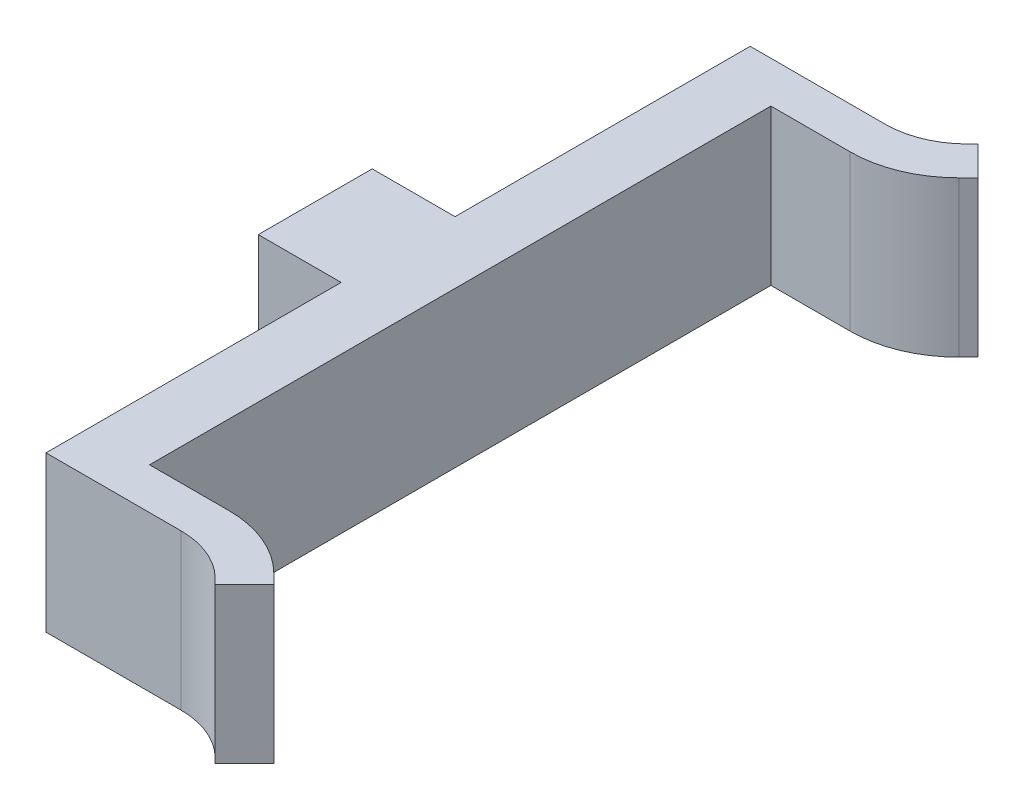
ISO-10303-21;
HEADER;
FILE_DESCRIPTION(('STEP AP214'),'2;1');
FILE_NAME('part.step','',(''),(''),'','','');
FILE_SCHEMA(('AUTOMOTIVE_DESIGN { 1 0 10303 214 1 1 1 1 }'));
ENDSEC;
DATA;
#1=APPLICATION_CONTEXT('core data for automotive mechanical design processes');
#2=APPLICATION_PROTOCOL_DEFINITION('international standard','automotive_design',2000,#1);
#3=PRODUCT_CONTEXT('',#1,'mechanical');
#4=PRODUCT('Part','Part','',(#3));
#5=PRODUCT_RELATED_PRODUCT_CATEGORY('part','',(#4));
#6=PRODUCT_DEFINITION_FORMATION('','',#4);
#7=PRODUCT_DEFINITION_CONTEXT('part definition',#1,'design');
#8=PRODUCT_DEFINITION('design','',#6,#7);
#9=PRODUCT_DEFINITION_SHAPE('','',#8);
#10=(LENGTH_UNIT() NAMED_UNIT(*) SI_UNIT(.MILLI.,.METRE.));
#11=(NAMED_UNIT(*) PLANE_ANGLE_UNIT() SI_UNIT($,.RADIAN.));
#12=(NAMED_UNIT(*) SI_UNIT($,.STERADIAN.) SOLID_ANGLE_UNIT());
#13=UNCERTAINTY_MEASURE_WITH_UNIT(LENGTH_MEASURE(1.E-05),#10,'distance_accuracy_value','');
#14=(GEOMETRIC_REPRESENTATION_CONTEXT(3) GLOBAL_UNCERTAINTY_ASSIGNED_CONTEXT((#13)) GLOBAL_UNIT_ASSIGNED_CONTEXT((#10,
#11,#12)) REPRESENTATION_CONTEXT('',''));
#15=CARTESIAN_POINT('',(0.,0.,0.));
#16=DIRECTION('',(0.,0.,1.));
#17=DIRECTION('',(1.,0.,0.));
#18=AXIS2_PLACEMENT_3D('',#15,#16,#17);
#19=CARTESIAN_POINT('',(0.,15.,0.));
#20=DIRECTION('',(-1.,0.,0.));
#21=DIRECTION('',(0.,0.,1.));
#22=AXIS2_PLACEMENT_3D('',#19,#20,#21);
#23=PLANE('',#22);
#24=DIRECTION('',(0.,0.,-1.));
#25=VECTOR('',#24,1.);
#26=CARTESIAN_POINT('',(0.,15.,0.));
#27=LINE('',#26,#25);
#28=CARTESIAN_POINT('',(0.,15.,34.));
#29=VERTEX_POINT('',#28);
#30=CARTESIAN_POINT('',(0.,15.,5.5));
#31=VERTEX_POINT('',#30);
#32=EDGE_CURVE('E281',#29,#31,#27,.T.);
#33=ORIENTED_EDGE('',*,*,#32,.T.);
#34=DIRECTION('',(0.,1.,0.));
#35=VECTOR('',#34,1.);
#36=CARTESIAN_POINT('',(0.,0.,5.5));
#37=LINE('',#36,#35);
#38=CARTESIAN_POINT('',(0.,0.,5.5));
#39=VERTEX_POINT('',#38);
#40=EDGE_CURVE('E64',#39,#31,#37,.T.);
#41=ORIENTED_EDGE('',*,*,#40,.F.);
#42=DIRECTION('',(0.,0.,-1.));
#43=VECTOR('',#42,1.);
#44=CARTESIAN_POINT('',(0.,0.,0.));
#45=LINE('',#44,#43);
#46=CARTESIAN_POINT('',(0.,0.,34.));
#47=VERTEX_POINT('',#46);
#48=EDGE_CURVE('E322',#47,#39,#45,.T.);
#49=ORIENTED_EDGE('',*,*,#48,.F.);
#50=DIRECTION('',(0.,-1.,0.));
#51=VECTOR('',#50,1.);
#52=CARTESIAN_POINT('',(0.,15.,34.));
#53=LINE('',#52,#51);
#54=EDGE_CURVE('E388',#29,#47,#53,.T.);
#55=ORIENTED_EDGE('',*,*,#54,.F.);
#56=EDGE_LOOP('',(#33,#41,#49,#55));
#57=FACE_BOUND('',#56,.T.);
#58=ADVANCED_FACE('F35',(#57),#23,.T.);
#59=DIRECTION('',(0.,1.,0.));
#60=VECTOR('',#59,1.);
#61=CARTESIAN_POINT('',(0.,0.,-5.5));
#62=LINE('',#61,#60);
#63=CARTESIAN_POINT('',(0.,0.,-5.5));
#64=VERTEX_POINT('',#63);
#65=CARTESIAN_POINT('',(0.,15.,-5.5));
#66=VERTEX_POINT('',#65);
#67=EDGE_CURVE('E56',#64,#66,#62,.T.);
#68=ORIENTED_EDGE('',*,*,#67,.T.);
#69=CARTESIAN_POINT('',(0.,15.,-34.));
#70=VERTEX_POINT('',#69);
#71=EDGE_CURVE('E234',#66,#70,#27,.T.);
#72=ORIENTED_EDGE('',*,*,#71,.T.);
#73=DIRECTION('',(0.,-1.,0.));
#74=VECTOR('',#73,1.);
#75=CARTESIAN_POINT('',(0.,15.,-34.));
#76=LINE('',#75,#74);
#77=CARTESIAN_POINT('',(0.,0.,-34.));
#78=VERTEX_POINT('',#77);
#79=EDGE_CURVE('E390',#70,#78,#76,.T.);
#80=ORIENTED_EDGE('',*,*,#79,.T.);
#81=EDGE_CURVE('E321',#64,#78,#45,.T.);
#82=ORIENTED_EDGE('',*,*,#81,.F.);
#83=EDGE_LOOP('',(#68,#72,#80,#82));
#84=FACE_BOUND('',#83,.T.);
#85=ADVANCED_FACE('F474',(#84),#23,.T.);
#86=CARTESIAN_POINT('',(13.0294372515229,15.,-42.));
#87=DIRECTION('',(0.,-1.,0.));
#88=DIRECTION('',(0.,0.,-1.));
#89=AXIS2_PLACEMENT_3D('',#86,#87,#88);
#90=CYLINDRICAL_SURFACE('',#89,8.);
#91=CARTESIAN_POINT('',(13.0294372515229,0.,-42.));
#92=DIRECTION('',(0.,1.,0.));
#93=DIRECTION('',(0.,0.,1.));
#94=AXIS2_PLACEMENT_3D('',#91,#92,#93);
#95=CIRCLE('',#94,8.);
#96=CARTESIAN_POINT('',(13.0294372515228,0.,-34.));
#97=VERTEX_POINT('',#96);
#98=CARTESIAN_POINT('',(18.6862915010153,0.,-36.3431457505077));
#99=VERTEX_POINT('',#98);
#100=EDGE_CURVE('E224',#97,#99,#95,.T.);
#101=ORIENTED_EDGE('',*,*,#100,.F.);
#102=DIRECTION('',(0.,-1.,0.));
#103=VECTOR('',#102,1.);
#104=CARTESIAN_POINT('',(13.0294372515228,15.,-34.));
#105=LINE('',#104,#103);
#106=CARTESIAN_POINT('',(13.0294372515228,15.,-34.));
#107=VERTEX_POINT('',#106);
#108=EDGE_CURVE('E393',#107,#97,#105,.T.);
#109=ORIENTED_EDGE('',*,*,#108,.F.);
#110=CARTESIAN_POINT('',(13.0294372515229,15.,-42.));
#111=DIRECTION('',(0.,1.,0.));
#112=DIRECTION('',(0.,0.,1.));
#113=AXIS2_PLACEMENT_3D('',#110,#111,#112);
#114=CIRCLE('',#113,8.);
#115=CARTESIAN_POINT('',(18.6862915010153,15.,-36.3431457505077));
#116=VERTEX_POINT('',#115);
#117=EDGE_CURVE('E274',#107,#116,#114,.T.);
#118=ORIENTED_EDGE('',*,*,#117,.T.);
#119=DIRECTION('',(0.,-1.,0.));
#120=VECTOR('',#119,1.);
#121=CARTESIAN_POINT('',(18.6862915010153,15.,-36.3431457505077));
#122=LINE('',#121,#120);
#123=EDGE_CURVE('E315',#116,#99,#122,.T.);
#124=ORIENTED_EDGE('',*,*,#123,.T.);
#125=EDGE_LOOP('',(#101,#109,#118,#124));
#126=FACE_BOUND('',#125,.T.);
#127=ADVANCED_FACE('F481',(#126),#90,.F.);
#128=CARTESIAN_POINT('',(0.,15.,-34.));
#129=DIRECTION('',(0.,0.,-1.));
#130=DIRECTION('',(-1.,0.,0.));
#131=AXIS2_PLACEMENT_3D('',#128,#129,#130);
#132=PLANE('',#131);
#133=DIRECTION('',(1.,0.,0.));
#134=VECTOR('',#133,1.);
#135=CARTESIAN_POINT('',(0.,0.,-34.));
#136=LINE('',#135,#134);
#137=EDGE_CURVE('E318',#78,#97,#136,.T.);
#138=ORIENTED_EDGE('',*,*,#137,.F.);
#139=ORIENTED_EDGE('',*,*,#79,.F.);
#140=DIRECTION('',(1.,0.,0.));
#141=VECTOR('',#140,1.);
#142=CARTESIAN_POINT('',(0.,15.,-34.));
#143=LINE('',#142,#141);
#144=EDGE_CURVE('E277',#70,#107,#143,.T.);
#145=ORIENTED_EDGE('',*,*,#144,.T.);
#146=ORIENTED_EDGE('',*,*,#108,.T.);
#147=EDGE_LOOP('',(#138,#139,#145,#146));
#148=FACE_BOUND('',#147,.T.);
#149=ADVANCED_FACE('F486',(#148),#132,.T.);
#150=CARTESIAN_POINT('',(0.,15.,34.));
#151=DIRECTION('',(0.,0.,-1.));
#152=DIRECTION('',(-1.,0.,0.));
#153=AXIS2_PLACEMENT_3D('',#150,#151,#152);
#154=PLANE('',#153);
#155=DIRECTION('',(1.,0.,0.));
#156=VECTOR('',#155,1.);
#157=CARTESIAN_POINT('',(0.,0.,34.));
#158=LINE('',#157,#156);
#159=CARTESIAN_POINT('',(13.0294372515228,0.,34.));
#160=VERTEX_POINT('',#159);
#161=EDGE_CURVE('E325',#47,#160,#158,.T.);
#162=ORIENTED_EDGE('',*,*,#161,.T.);
#163=DIRECTION('',(0.,-1.,0.));
#164=VECTOR('',#163,1.);
#165=CARTESIAN_POINT('',(13.0294372515228,15.,34.));
#166=LINE('',#165,#164);
#167=CARTESIAN_POINT('',(13.0294372515228,15.,34.));
#168=VERTEX_POINT('',#167);
#169=EDGE_CURVE('E385',#168,#160,#166,.T.);
#170=ORIENTED_EDGE('',*,*,#169,.F.);
#171=DIRECTION('',(1.,0.,0.));
#172=VECTOR('',#171,1.);
#173=CARTESIAN_POINT('',(0.,15.,34.));
#174=LINE('',#173,#172);
#175=EDGE_CURVE('E283',#29,#168,#174,.T.);
#176=ORIENTED_EDGE('',*,*,#175,.F.);
#177=ORIENTED_EDGE('',*,*,#54,.T.);
#178=EDGE_LOOP('',(#162,#170,#176,#177));
#179=FACE_BOUND('',#178,.T.);
#180=ADVANCED_FACE('F484',(#179),#154,.F.);
#181=CARTESIAN_POINT('',(13.0294372515229,15.,42.));
#182=DIRECTION('',(0.,-1.,0.));
#183=DIRECTION('',(0.,0.,-1.));
#184=AXIS2_PLACEMENT_3D('',#181,#182,#183);
#185=CYLINDRICAL_SURFACE('',#184,8.);
#186=CARTESIAN_POINT('',(13.0294372515229,0.,42.));
#187=DIRECTION('',(0.,1.,0.));
#188=DIRECTION('',(0.,0.,1.));
#189=AXIS2_PLACEMENT_3D('',#186,#187,#188);
#190=CIRCLE('',#189,8.);
#191=CARTESIAN_POINT('',(18.6862915010153,0.,36.3431457505077));
#192=VERTEX_POINT('',#191);
#193=EDGE_CURVE('E327',#160,#192,#190,.F.);
#194=ORIENTED_EDGE('',*,*,#193,.T.);
#195=DIRECTION('',(0.,-1.,0.));
#196=VECTOR('',#195,1.);
#197=CARTESIAN_POINT('',(18.6862915010153,15.,36.3431457505077));
#198=LINE('',#197,#196);
#199=CARTESIAN_POINT('',(18.6862915010153,15.,36.3431457505077));
#200=VERTEX_POINT('',#199);
#201=EDGE_CURVE('E382',#200,#192,#198,.T.);
#202=ORIENTED_EDGE('',*,*,#201,.F.);
#203=CARTESIAN_POINT('',(13.0294372515229,15.,42.));
#204=DIRECTION('',(0.,1.,0.));
#205=DIRECTION('',(0.,0.,1.));
#206=AXIS2_PLACEMENT_3D('',#203,#204,#205);
#207=CIRCLE('',#206,8.);
#208=EDGE_CURVE('E285',#168,#200,#207,.F.);
#209=ORIENTED_EDGE('',*,*,#208,.F.);
#210=ORIENTED_EDGE('',*,*,#169,.T.);
#211=EDGE_LOOP('',(#194,#202,#209,#210));
#212=FACE_BOUND('',#211,.T.);
#213=ADVANCED_FACE('F552',(#212),#185,.F.);
#214=CARTESIAN_POINT('',(-8.82842712474619,15.,8.82842712474619));
#215=DIRECTION('',(0.707106781186547,0.,-0.707106781186547));
#216=DIRECTION('',(-0.707106781186548,0.,-0.707106781186548));
#217=AXIS2_PLACEMENT_3D('',#214,#215,#216);
#218=PLANE('',#217);
#219=DIRECTION('',(0.707106781186548,0.,0.707106781186548));
#220=VECTOR('',#219,1.);
#221=CARTESIAN_POINT('',(-8.82842712474619,0.,8.82842712474619));
#222=LINE('',#221,#220);
#223=CARTESIAN_POINT('',(19.1715728752538,0.,36.8284271247462));
#224=VERTEX_POINT('',#223);
#225=EDGE_CURVE('E329',#192,#224,#222,.T.);
#226=ORIENTED_EDGE('',*,*,#225,.T.);
#227=DIRECTION('',(0.,-1.,0.));
#228=VECTOR('',#227,1.);
#229=CARTESIAN_POINT('',(19.1715728752538,15.,36.8284271247462));
#230=LINE('',#229,#228);
#231=CARTESIAN_POINT('',(19.1715728752538,15.,36.8284271247462));
#232=VERTEX_POINT('',#231);
#233=EDGE_CURVE('E379',#232,#224,#230,.T.);
#234=ORIENTED_EDGE('',*,*,#233,.F.);
#235=DIRECTION('',(0.707106781186548,0.,0.707106781186548));
#236=VECTOR('',#235,1.);
#237=CARTESIAN_POINT('',(-8.82842712474619,15.,8.82842712474619));
#238=LINE('',#237,#236);
#239=EDGE_CURVE('E287',#200,#232,#238,.T.);
#240=ORIENTED_EDGE('',*,*,#239,.F.);
#241=ORIENTED_EDGE('',*,*,#201,.T.);
#242=EDGE_LOOP('',(#226,#234,#240,#241));
#243=FACE_BOUND('',#242,.T.);
#244=ADVANCED_FACE('F547',(#243),#218,.F.);
#245=CARTESIAN_POINT('',(28.,15.,28.));
#246=DIRECTION('',(-0.707106781186548,0.,-0.707106781186547));
#247=DIRECTION('',(-0.707106781186547,0.,0.707106781186548));
#248=AXIS2_PLACEMENT_3D('',#245,#246,#247);
#249=PLANE('',#248);
#250=DIRECTION('',(0.707106781186547,0.,-0.707106781186548));
#251=VECTOR('',#250,1.);
#252=CARTESIAN_POINT('',(28.,0.,28.));
#253=LINE('',#252,#251);
#254=CARTESIAN_POINT('',(22.,0.,34.));
#255=VERTEX_POINT('',#254);
#256=EDGE_CURVE('E331',#224,#255,#253,.T.);
#257=ORIENTED_EDGE('',*,*,#256,.T.);
#258=DIRECTION('',(0.,-1.,0.));
#259=VECTOR('',#258,1.);
#260=CARTESIAN_POINT('',(22.,15.,34.));
#261=LINE('',#260,#259);
#262=CARTESIAN_POINT('',(22.,15.,34.));
#263=VERTEX_POINT('',#262);
#264=EDGE_CURVE('E376',#263,#255,#261,.T.);
#265=ORIENTED_EDGE('',*,*,#264,.F.);
#266=DIRECTION('',(0.707106781186547,0.,-0.707106781186548));
#267=VECTOR('',#266,1.);
#268=CARTESIAN_POINT('',(28.,15.,28.));
#269=LINE('',#268,#267);
#270=EDGE_CURVE('E289',#232,#263,#269,.T.);
#271=ORIENTED_EDGE('',*,*,#270,.F.);
#272=ORIENTED_EDGE('',*,*,#233,.T.);
#273=EDGE_LOOP('',(#257,#265,#271,#272));
#274=FACE_BOUND('',#273,.T.);
#275=ADVANCED_FACE('F541',(#274),#249,.F.);
#276=CARTESIAN_POINT('',(-6.,15.,6.));
#277=DIRECTION('',(-0.707106781186547,0.,0.707106781186547));
#278=DIRECTION('',(0.707106781186548,0.,0.707106781186548));
#279=AXIS2_PLACEMENT_3D('',#276,#277,#278);
#280=PLANE('',#279);
#281=DIRECTION('',(-0.707106781186548,0.,-0.707106781186548));
#282=VECTOR('',#281,1.);
#283=CARTESIAN_POINT('',(-6.,0.,6.));
#284=LINE('',#283,#282);
#285=CARTESIAN_POINT('',(21.0753787975413,0.,33.0753787975413));
#286=VERTEX_POINT('',#285);
#287=EDGE_CURVE('E333',#255,#286,#284,.T.);
#288=ORIENTED_EDGE('',*,*,#287,.T.);
#289=DIRECTION('',(0.,-1.,0.));
#290=VECTOR('',#289,1.);
#291=CARTESIAN_POINT('',(21.0753787975413,15.,33.0753787975413));
#292=LINE('',#291,#290);
#293=CARTESIAN_POINT('',(21.0753787975413,15.,33.0753787975413));
#294=VERTEX_POINT('',#293);
#295=EDGE_CURVE('E373',#294,#286,#292,.T.);
#296=ORIENTED_EDGE('',*,*,#295,.F.);
#297=DIRECTION('',(-0.707106781186548,0.,-0.707106781186548));
#298=VECTOR('',#297,1.);
#299=CARTESIAN_POINT('',(-6.,15.,6.));
#300=LINE('',#299,#298);
#301=EDGE_CURVE('E291',#263,#294,#300,.T.);
#302=ORIENTED_EDGE('',*,*,#301,.F.);
#303=ORIENTED_EDGE('',*,*,#264,.T.);
#304=EDGE_LOOP('',(#288,#296,#302,#303));
#305=FACE_BOUND('',#304,.T.);
#306=ADVANCED_FACE('F537',(#305),#280,.F.);
#307=CARTESIAN_POINT('',(13.6507575950825,15.,40.5));
#308=DIRECTION('',(0.,-1.,0.));
#309=DIRECTION('',(0.,0.,-1.));
#310=AXIS2_PLACEMENT_3D('',#307,#308,#309);
#311=CYLINDRICAL_SURFACE('',#310,10.5);
#312=CARTESIAN_POINT('',(13.6507575950825,0.,40.5));
#313=DIRECTION('',(0.,1.,0.));
#314=DIRECTION('',(0.,0.,1.));
#315=AXIS2_PLACEMENT_3D('',#312,#313,#314);
#316=CIRCLE('',#315,10.5);
#317=CARTESIAN_POINT('',(13.6507575950825,0.,30.));
#318=VERTEX_POINT('',#317);
#319=EDGE_CURVE('E335',#286,#318,#316,.T.);
#320=ORIENTED_EDGE('',*,*,#319,.T.);
#321=DIRECTION('',(0.,-1.,0.));
#322=VECTOR('',#321,1.);
#323=CARTESIAN_POINT('',(13.6507575950825,15.,30.));
#324=LINE('',#323,#322);
#325=CARTESIAN_POINT('',(13.6507575950825,15.,30.));
#326=VERTEX_POINT('',#325);
#327=EDGE_CURVE('E370',#326,#318,#324,.T.);
#328=ORIENTED_EDGE('',*,*,#327,.F.);
#329=CARTESIAN_POINT('',(13.6507575950825,15.,40.5));
#330=DIRECTION('',(0.,1.,0.));
#331=DIRECTION('',(0.,0.,1.));
#332=AXIS2_PLACEMENT_3D('',#329,#330,#331);
#333=CIRCLE('',#332,10.5);
#334=EDGE_CURVE('E293',#294,#326,#333,.T.);
#335=ORIENTED_EDGE('',*,*,#334,.F.);
#336=ORIENTED_EDGE('',*,*,#295,.T.);
#337=EDGE_LOOP('',(#320,#328,#335,#336));
#338=FACE_BOUND('',#337,.T.);
#339=ADVANCED_FACE('F532',(#338),#311,.T.);
#340=CARTESIAN_POINT('',(0.,15.,30.));
#341=DIRECTION('',(0.,0.,1.));
#342=DIRECTION('',(1.,0.,0.));
#343=AXIS2_PLACEMENT_3D('',#340,#341,#342);
#344=PLANE('',#343);
#345=DIRECTION('',(-1.,0.,0.));
#346=VECTOR('',#345,1.);
#347=CARTESIAN_POINT('',(0.,0.,30.));
#348=LINE('',#347,#346);
#349=CARTESIAN_POINT('',(6.,0.,30.));
#350=VERTEX_POINT('',#349);
#351=EDGE_CURVE('E337',#318,#350,#348,.T.);
#352=ORIENTED_EDGE('',*,*,#351,.T.);
#353=DIRECTION('',(0.,-1.,0.));
#354=VECTOR('',#353,1.);
#355=CARTESIAN_POINT('',(6.,15.,30.));
#356=LINE('',#355,#354);
#357=CARTESIAN_POINT('',(6.,15.,30.));
#358=VERTEX_POINT('',#357);
#359=EDGE_CURVE('E368',#358,#350,#356,.T.);
#360=ORIENTED_EDGE('',*,*,#359,.F.);
#361=DIRECTION('',(-1.,0.,0.));
#362=VECTOR('',#361,1.);
#363=CARTESIAN_POINT('',(0.,15.,30.));
#364=LINE('',#363,#362);
#365=EDGE_CURVE('E295',#326,#358,#364,.T.);
#366=ORIENTED_EDGE('',*,*,#365,.F.);
#367=ORIENTED_EDGE('',*,*,#327,.T.);
#368=EDGE_LOOP('',(#352,#360,#366,#367));
#369=FACE_BOUND('',#368,.T.);
#370=ADVANCED_FACE('F526',(#369),#344,.F.);
#371=CARTESIAN_POINT('',(6.,15.,0.));
#372=DIRECTION('',(1.,0.,0.));
#373=DIRECTION('',(0.,0.,-1.));
#374=AXIS2_PLACEMENT_3D('',#371,#372,#373);
#375=PLANE('',#374);
#376=DIRECTION('',(0.,0.,1.));
#377=VECTOR('',#376,1.);
#378=CARTESIAN_POINT('',(6.,0.,0.));
#379=LINE('',#378,#377);
#380=CARTESIAN_POINT('',(6.,0.,-30.));
#381=VERTEX_POINT('',#380);
#382=EDGE_CURVE('E340',#381,#350,#379,.T.);
#383=ORIENTED_EDGE('',*,*,#382,.F.);
#384=DIRECTION('',(0.,-1.,0.));
#385=VECTOR('',#384,1.);
#386=CARTESIAN_POINT('',(6.,15.,-30.));
#387=LINE('',#386,#385);
#388=CARTESIAN_POINT('',(6.,15.,-30.));
#389=VERTEX_POINT('',#388);
#390=EDGE_CURVE('E366',#389,#381,#387,.T.);
#391=ORIENTED_EDGE('',*,*,#390,.F.);
#392=DIRECTION('',(0.,0.,1.));
#393=VECTOR('',#392,1.);
#394=CARTESIAN_POINT('',(6.,15.,0.));
#395=LINE('',#394,#393);
#396=EDGE_CURVE('E297',#389,#358,#395,.T.);
#397=ORIENTED_EDGE('',*,*,#396,.T.);
#398=ORIENTED_EDGE('',*,*,#359,.T.);
#399=EDGE_LOOP('',(#383,#391,#397,#398));
#400=FACE_BOUND('',#399,.T.);
#401=ADVANCED_FACE('F522',(#400),#375,.T.);
#402=CARTESIAN_POINT('',(0.,15.,-30.));
#403=DIRECTION('',(0.,0.,1.));
#404=DIRECTION('',(1.,0.,0.));
#405=AXIS2_PLACEMENT_3D('',#402,#403,#404);
#406=PLANE('',#405);
#407=DIRECTION('',(-1.,0.,0.));
#408=VECTOR('',#407,1.);
#409=CARTESIAN_POINT('',(0.,0.,-30.));
#410=LINE('',#409,#408);
#411=CARTESIAN_POINT('',(13.6507575950825,0.,-30.));
#412=VERTEX_POINT('',#411);
#413=EDGE_CURVE('E343',#412,#381,#410,.T.);
#414=ORIENTED_EDGE('',*,*,#413,.F.);
#415=DIRECTION('',(0.,-1.,0.));
#416=VECTOR('',#415,1.);
#417=CARTESIAN_POINT('',(13.6507575950825,15.,-30.));
#418=LINE('',#417,#416);
#419=CARTESIAN_POINT('',(13.6507575950825,15.,-30.));
#420=VERTEX_POINT('',#419);
#421=EDGE_CURVE('E364',#420,#412,#418,.T.);
#422=ORIENTED_EDGE('',*,*,#421,.F.);
#423=DIRECTION('',(-1.,0.,0.));
#424=VECTOR('',#423,1.);
#425=CARTESIAN_POINT('',(0.,15.,-30.));
#426=LINE('',#425,#424);
#427=EDGE_CURVE('E300',#420,#389,#426,.T.);
#428=ORIENTED_EDGE('',*,*,#427,.T.);
#429=ORIENTED_EDGE('',*,*,#390,.T.);
#430=EDGE_LOOP('',(#414,#422,#428,#429));
#431=FACE_BOUND('',#430,.T.);
#432=ADVANCED_FACE('F518',(#431),#406,.T.);
#433=CARTESIAN_POINT('',(13.6507575950825,15.,-40.5));
#434=DIRECTION('',(0.,-1.,0.));
#435=DIRECTION('',(0.,0.,-1.));
#436=AXIS2_PLACEMENT_3D('',#433,#434,#435);
#437=CYLINDRICAL_SURFACE('',#436,10.5);
#438=CARTESIAN_POINT('',(13.6507575950825,0.,-40.5));
#439=DIRECTION('',(0.,1.,0.));
#440=DIRECTION('',(0.,0.,1.));
#441=AXIS2_PLACEMENT_3D('',#438,#439,#440);
#442=CIRCLE('',#441,10.5);
#443=CARTESIAN_POINT('',(21.0753787975413,0.,-33.0753787975413));
#444=VERTEX_POINT('',#443);
#445=EDGE_CURVE('E346',#444,#412,#442,.F.);
#446=ORIENTED_EDGE('',*,*,#445,.F.);
#447=DIRECTION('',(0.,-1.,0.));
#448=VECTOR('',#447,1.);
#449=CARTESIAN_POINT('',(21.0753787975413,15.,-33.0753787975413));
#450=LINE('',#449,#448);
#451=CARTESIAN_POINT('',(21.0753787975413,15.,-33.0753787975413));
#452=VERTEX_POINT('',#451);
#453=EDGE_CURVE('E362',#452,#444,#450,.T.);
#454=ORIENTED_EDGE('',*,*,#453,.F.);
#455=CARTESIAN_POINT('',(13.6507575950825,15.,-40.5));
#456=DIRECTION('',(0.,1.,0.));
#457=DIRECTION('',(0.,0.,1.));
#458=AXIS2_PLACEMENT_3D('',#455,#456,#457);
#459=CIRCLE('',#458,10.5);
#460=EDGE_CURVE('E303',#452,#420,#459,.F.);
#461=ORIENTED_EDGE('',*,*,#460,.T.);
#462=ORIENTED_EDGE('',*,*,#421,.T.);
#463=EDGE_LOOP('',(#446,#454,#461,#462));
#464=FACE_BOUND('',#463,.T.);
#465=ADVANCED_FACE('F513',(#464),#437,.T.);
#466=CARTESIAN_POINT('',(-6.,15.,-6.));
#467=DIRECTION('',(0.707106781186547,0.,0.707106781186547));
#468=DIRECTION('',(0.707106781186548,0.,-0.707106781186548));
#469=AXIS2_PLACEMENT_3D('',#466,#467,#468);
#470=PLANE('',#469);
#471=DIRECTION('',(-0.707106781186548,0.,0.707106781186548));
#472=VECTOR('',#471,1.);
#473=CARTESIAN_POINT('',(-6.,0.,-6.));
#474=LINE('',#473,#472);
#475=CARTESIAN_POINT('',(22.,0.,-34.));
#476=VERTEX_POINT('',#475);
#477=EDGE_CURVE('E349',#476,#444,#474,.T.);
#478=ORIENTED_EDGE('',*,*,#477,.F.);
#479=DIRECTION('',(0.,-1.,0.));
#480=VECTOR('',#479,1.);
#481=CARTESIAN_POINT('',(22.,15.,-34.));
#482=LINE('',#481,#480);
#483=CARTESIAN_POINT('',(22.,15.,-34.));
#484=VERTEX_POINT('',#483);
#485=EDGE_CURVE('E360',#484,#476,#482,.T.);
#486=ORIENTED_EDGE('',*,*,#485,.F.);
#487=DIRECTION('',(-0.707106781186548,0.,0.707106781186548));
#488=VECTOR('',#487,1.);
#489=CARTESIAN_POINT('',(-6.,15.,-6.));
#490=LINE('',#489,#488);
#491=EDGE_CURVE('E306',#484,#452,#490,.T.);
#492=ORIENTED_EDGE('',*,*,#491,.T.);
#493=ORIENTED_EDGE('',*,*,#453,.T.);
#494=EDGE_LOOP('',(#478,#486,#492,#493));
#495=FACE_BOUND('',#494,.T.);
#496=ADVANCED_FACE('F509',(#495),#470,.T.);
#497=CARTESIAN_POINT('',(28.,15.,-28.));
#498=DIRECTION('',(0.707106781186548,0.,-0.707106781186547));
#499=DIRECTION('',(-0.707106781186547,0.,-0.707106781186548));
#500=AXIS2_PLACEMENT_3D('',#497,#498,#499);
#501=PLANE('',#500);
#502=DIRECTION('',(0.707106781186547,0.,0.707106781186548));
#503=VECTOR('',#502,1.);
#504=CARTESIAN_POINT('',(28.,0.,-28.));
#505=LINE('',#504,#503);
#506=CARTESIAN_POINT('',(19.1715728752538,0.,-36.8284271247462));
#507=VERTEX_POINT('',#506);
#508=EDGE_CURVE('E352',#507,#476,#505,.T.);
#509=ORIENTED_EDGE('',*,*,#508,.F.);
#510=DIRECTION('',(0.,-1.,0.));
#511=VECTOR('',#510,1.);
#512=CARTESIAN_POINT('',(19.1715728752538,15.,-36.8284271247462));
#513=LINE('',#512,#511);
#514=CARTESIAN_POINT('',(19.1715728752538,15.,-36.8284271247462));
#515=VERTEX_POINT('',#514);
#516=EDGE_CURVE('E358',#515,#507,#513,.T.);
#517=ORIENTED_EDGE('',*,*,#516,.F.);
#518=DIRECTION('',(0.707106781186547,0.,0.707106781186548));
#519=VECTOR('',#518,1.);
#520=CARTESIAN_POINT('',(28.,15.,-28.));
#521=LINE('',#520,#519);
#522=EDGE_CURVE('E309',#515,#484,#521,.T.);
#523=ORIENTED_EDGE('',*,*,#522,.T.);
#524=ORIENTED_EDGE('',*,*,#485,.T.);
#525=EDGE_LOOP('',(#509,#517,#523,#524));
#526=FACE_BOUND('',#525,.T.);
#527=ADVANCED_FACE('F507',(#526),#501,.T.);
#528=CARTESIAN_POINT('',(-8.82842712474619,15.,-8.82842712474619));
#529=DIRECTION('',(-0.707106781186547,0.,-0.707106781186547));
#530=DIRECTION('',(-0.707106781186548,0.,0.707106781186548));
#531=AXIS2_PLACEMENT_3D('',#528,#529,#530);
#532=PLANE('',#531);
#533=DIRECTION('',(0.707106781186548,0.,-0.707106781186548));
#534=VECTOR('',#533,1.);
#535=CARTESIAN_POINT('',(-8.82842712474619,0.,-8.82842712474619));
#536=LINE('',#535,#534);
#537=EDGE_CURVE('E278',#99,#507,#536,.T.);
#538=ORIENTED_EDGE('',*,*,#537,.F.);
#539=ORIENTED_EDGE('',*,*,#123,.F.);
#540=DIRECTION('',(0.707106781186548,0.,-0.707106781186548));
#541=VECTOR('',#540,1.);
#542=CARTESIAN_POINT('',(-8.82842712474619,15.,-8.82842712474619));
#543=LINE('',#542,#541);
#544=EDGE_CURVE('E312',#116,#515,#543,.T.);
#545=ORIENTED_EDGE('',*,*,#544,.T.);
#546=ORIENTED_EDGE('',*,*,#516,.T.);
#547=EDGE_LOOP('',(#538,#539,#545,#546));
#548=FACE_BOUND('',#547,.T.);
#549=ADVANCED_FACE('F503',(#548),#532,.T.);
#550=CARTESIAN_POINT('',(0.,15.,0.));
#551=DIRECTION('',(0.,1.,0.));
#552=DIRECTION('',(0.,0.,1.));
#553=AXIS2_PLACEMENT_3D('',#550,#551,#552);
#554=PLANE('',#553);
#555=ORIENTED_EDGE('',*,*,#117,.F.);
#556=ORIENTED_EDGE('',*,*,#144,.F.);
#557=ORIENTED_EDGE('',*,*,#71,.F.);
#558=DIRECTION('',(-1.,0.,0.));
#559=VECTOR('',#558,1.);
#560=CARTESIAN_POINT('',(0.,15.,-5.5));
#561=LINE('',#560,#559);
#562=CARTESIAN_POINT('',(-8.,15.,-5.5));
#563=VERTEX_POINT('',#562);
#564=EDGE_CURVE('E217',#66,#563,#561,.T.);
#565=ORIENTED_EDGE('',*,*,#564,.T.);
#566=DIRECTION('',(0.,0.,1.));
#567=VECTOR('',#566,1.);
#568=CARTESIAN_POINT('',(-8.,15.,-5.5));
#569=LINE('',#568,#567);
#570=CARTESIAN_POINT('',(-8.,15.,5.5));
#571=VERTEX_POINT('',#570);
#572=EDGE_CURVE('E232',#563,#571,#569,.T.);
#573=ORIENTED_EDGE('',*,*,#572,.T.);
#574=DIRECTION('',(1.,0.,0.));
#575=VECTOR('',#574,1.);
#576=CARTESIAN_POINT('',(-8.,15.,5.5));
#577=LINE('',#576,#575);
#578=EDGE_CURVE('E235',#571,#31,#577,.T.);
#579=ORIENTED_EDGE('',*,*,#578,.T.);
#580=ORIENTED_EDGE('',*,*,#32,.F.);
#581=ORIENTED_EDGE('',*,*,#175,.T.);
#582=ORIENTED_EDGE('',*,*,#208,.T.);
#583=ORIENTED_EDGE('',*,*,#239,.T.);
#584=ORIENTED_EDGE('',*,*,#270,.T.);
#585=ORIENTED_EDGE('',*,*,#301,.T.);
#586=ORIENTED_EDGE('',*,*,#334,.T.);
#587=ORIENTED_EDGE('',*,*,#365,.T.);
#588=ORIENTED_EDGE('',*,*,#396,.F.);
#589=ORIENTED_EDGE('',*,*,#427,.F.);
#590=ORIENTED_EDGE('',*,*,#460,.F.);
#591=ORIENTED_EDGE('',*,*,#491,.F.);
#592=ORIENTED_EDGE('',*,*,#522,.F.);
#593=ORIENTED_EDGE('',*,*,#544,.F.);
#594=EDGE_LOOP('',(#555,#556,#557,#565,#573,#579,#580,#581,#582,#583,#584,#585,#586,#587,#588,
#589,#590,#591,#592,#593));
#595=FACE_BOUND('',#594,.T.);
#596=ADVANCED_FACE('F230',(#595),#554,.T.);
#597=CARTESIAN_POINT('',(0.,0.,0.));
#598=DIRECTION('',(0.,1.,0.));
#599=DIRECTION('',(0.,0.,1.));
#600=AXIS2_PLACEMENT_3D('',#597,#598,#599);
#601=PLANE('',#600);
#602=ORIENTED_EDGE('',*,*,#100,.T.);
#603=ORIENTED_EDGE('',*,*,#537,.T.);
#604=ORIENTED_EDGE('',*,*,#508,.T.);
#605=ORIENTED_EDGE('',*,*,#477,.T.);
#606=ORIENTED_EDGE('',*,*,#445,.T.);
#607=ORIENTED_EDGE('',*,*,#413,.T.);
#608=ORIENTED_EDGE('',*,*,#382,.T.);
#609=ORIENTED_EDGE('',*,*,#351,.F.);
#610=ORIENTED_EDGE('',*,*,#319,.F.);
#611=ORIENTED_EDGE('',*,*,#287,.F.);
#612=ORIENTED_EDGE('',*,*,#256,.F.);
#613=ORIENTED_EDGE('',*,*,#225,.F.);
#614=ORIENTED_EDGE('',*,*,#193,.F.);
#615=ORIENTED_EDGE('',*,*,#161,.F.);
#616=ORIENTED_EDGE('',*,*,#48,.T.);
#617=DIRECTION('',(-1.,0.,0.));
#618=VECTOR('',#617,1.);
#619=CARTESIAN_POINT('',(0.,0.,5.5));
#620=LINE('',#619,#618);
#621=CARTESIAN_POINT('',(-8.,0.,5.5));
#622=VERTEX_POINT('',#621);
#623=EDGE_CURVE('E239',#39,#622,#620,.T.);
#624=ORIENTED_EDGE('',*,*,#623,.T.);
#625=DIRECTION('',(0.,0.,-1.));
#626=VECTOR('',#625,1.);
#627=CARTESIAN_POINT('',(-8.,0.,5.5));
#628=LINE('',#627,#626);
#629=CARTESIAN_POINT('',(-8.,0.,-5.5));
#630=VERTEX_POINT('',#629);
#631=EDGE_CURVE('E245',#622,#630,#628,.T.);
#632=ORIENTED_EDGE('',*,*,#631,.T.);
#633=DIRECTION('',(1.,0.,0.));
#634=VECTOR('',#633,1.);
#635=CARTESIAN_POINT('',(-8.,0.,-5.5));
#636=LINE('',#635,#634);
#637=EDGE_CURVE('E219',#630,#64,#636,.T.);
#638=ORIENTED_EDGE('',*,*,#637,.T.);
#639=ORIENTED_EDGE('',*,*,#81,.T.);
#640=ORIENTED_EDGE('',*,*,#137,.T.);
#641=EDGE_LOOP('',(#602,#603,#604,#605,#606,#607,#608,#609,#610,#611,#612,#613,#614,#615,#616,
#624,#632,#638,#639,#640));
#642=FACE_BOUND('',#641,.T.);
#643=ADVANCED_FACE('F497',(#642),#601,.F.);
#644=CARTESIAN_POINT('',(-8.,0.,5.5));
#645=DIRECTION('',(0.,0.,-1.));
#646=DIRECTION('',(-1.,0.,0.));
#647=AXIS2_PLACEMENT_3D('',#644,#645,#646);
#648=PLANE('',#647);
#649=ORIENTED_EDGE('',*,*,#40,.T.);
#650=ORIENTED_EDGE('',*,*,#578,.F.);
#651=DIRECTION('',(0.,1.,0.));
#652=VECTOR('',#651,1.);
#653=CARTESIAN_POINT('',(-8.,0.,5.5));
#654=LINE('',#653,#652);
#655=EDGE_CURVE('E225',#622,#571,#654,.T.);
#656=ORIENTED_EDGE('',*,*,#655,.F.);
#657=ORIENTED_EDGE('',*,*,#623,.F.);
#658=EDGE_LOOP('',(#649,#650,#656,#657));
#659=FACE_BOUND('',#658,.T.);
#660=ADVANCED_FACE('F558',(#659),#648,.F.);
#661=CARTESIAN_POINT('',(-8.,0.,-5.5));
#662=DIRECTION('',(0.,0.,-1.));
#663=DIRECTION('',(-1.,0.,0.));
#664=AXIS2_PLACEMENT_3D('',#661,#662,#663);
#665=PLANE('',#664);
#666=ORIENTED_EDGE('',*,*,#67,.F.);
#667=ORIENTED_EDGE('',*,*,#637,.F.);
#668=DIRECTION('',(0.,1.,0.));
#669=VECTOR('',#668,1.);
#670=CARTESIAN_POINT('',(-8.,0.,-5.5));
#671=LINE('',#670,#669);
#672=EDGE_CURVE('E214',#630,#563,#671,.T.);
#673=ORIENTED_EDGE('',*,*,#672,.T.);
#674=ORIENTED_EDGE('',*,*,#564,.F.);
#675=EDGE_LOOP('',(#666,#667,#673,#674));
#676=FACE_BOUND('',#675,.T.);
#677=ADVANCED_FACE('F216',(#676),#665,.T.);
#678=CARTESIAN_POINT('',(-8.,0.,0.));
#679=DIRECTION('',(-1.,0.,0.));
#680=DIRECTION('',(0.,0.,1.));
#681=AXIS2_PLACEMENT_3D('',#678,#679,#680);
#682=PLANE('',#681);
#683=DIRECTION('',(0.,-1.,0.));
#684=VECTOR('',#683,1.);
#685=CARTESIAN_POINT('',(-8.,9.797079996589,-2.22961744635321));
#686=LINE('',#685,#684);
#687=CARTESIAN_POINT('',(-8.,5.06714035692195,-2.2296174463531));
#688=VERTEX_POINT('',#687);
#689=CARTESIAN_POINT('',(-8.,9.93285964307806,-2.22961744635321));
#690=VERTEX_POINT('',#689);
#691=EDGE_CURVE('E402',#688,#690,#686,.F.);
#692=ORIENTED_EDGE('',*,*,#691,.T.);
#693=CARTESIAN_POINT('',(-8.,7.5,0.));
#694=DIRECTION('',(-1.,0.,0.));
#695=DIRECTION('',(0.,0.,1.));
#696=AXIS2_PLACEMENT_3D('',#693,#694,#695);
#697=CIRCLE('',#696,3.3);
#698=CARTESIAN_POINT('',(-8.,9.93285964307806,2.22961744635321));
#699=VERTEX_POINT('',#698);
#700=EDGE_CURVE('E404',#690,#699,#697,.F.);
#701=ORIENTED_EDGE('',*,*,#700,.T.);
#702=DIRECTION('',(0.,-1.,0.));
#703=VECTOR('',#702,1.);
#704=CARTESIAN_POINT('',(-8.,0.,2.22961744635321));
#705=LINE('',#704,#703);
#706=CARTESIAN_POINT('',(-8.,5.06714035692195,2.22961744635321));
#707=VERTEX_POINT('',#706);
#708=EDGE_CURVE('E398',#699,#707,#705,.T.);
#709=ORIENTED_EDGE('',*,*,#708,.T.);
#710=CARTESIAN_POINT('',(-8.,7.5,0.));
#711=DIRECTION('',(-1.,0.,0.));
#712=DIRECTION('',(0.,0.,1.));
#713=AXIS2_PLACEMENT_3D('',#710,#711,#712);
#714=CIRCLE('',#713,3.3);
#715=EDGE_CURVE('E400',#707,#688,#714,.F.);
#716=ORIENTED_EDGE('',*,*,#715,.T.);
#717=EDGE_LOOP('',(#692,#701,#709,#716));
#718=FACE_BOUND('',#717,.T.);
#719=ORIENTED_EDGE('',*,*,#655,.T.);
#720=ORIENTED_EDGE('',*,*,#572,.F.);
#721=ORIENTED_EDGE('',*,*,#672,.F.);
#722=ORIENTED_EDGE('',*,*,#631,.F.);
#723=EDGE_LOOP('',(#719,#720,#721,#722));
#724=FACE_BOUND('',#723,.T.);
#725=ADVANCED_FACE('F237',(#718,#724),#682,.T.);
#726=CARTESIAN_POINT('',(0.,7.5,0.));
#727=DIRECTION('',(-1.,0.,0.));
#728=DIRECTION('',(0.,0.,1.));
#729=AXIS2_PLACEMENT_3D('',#726,#727,#728);
#730=CYLINDRICAL_SURFACE('',#729,3.);
#731=DIRECTION('',(-1.,0.,0.));
#732=VECTOR('',#731,1.);
#733=CARTESIAN_POINT('',(0.,9.797079996589,1.92961744635321));
#734=LINE('',#733,#732);
#735=CARTESIAN_POINT('',(0.,9.797079996589,1.92961744635321));
#736=VERTEX_POINT('',#735);
#737=CARTESIAN_POINT('',(-7.7,9.797079996589,1.92961744635321));
#738=VERTEX_POINT('',#737);
#739=EDGE_CURVE('E260',#736,#738,#734,.T.);
#740=ORIENTED_EDGE('',*,*,#739,.T.);
#741=CARTESIAN_POINT('',(-7.7,7.5,0.));
#742=DIRECTION('',(-1.,0.,0.));
#743=DIRECTION('',(0.,0.,1.));
#744=AXIS2_PLACEMENT_3D('',#741,#742,#743);
#745=CIRCLE('',#744,3.);
#746=CARTESIAN_POINT('',(-7.7,9.797079996589,-1.92961744635321));
#747=VERTEX_POINT('',#746);
#748=EDGE_CURVE('E395',#738,#747,#745,.T.);
#749=ORIENTED_EDGE('',*,*,#748,.T.);
#750=DIRECTION('',(-1.,0.,0.));
#751=VECTOR('',#750,1.);
#752=CARTESIAN_POINT('',(0.,9.797079996589,-1.92961744635321));
#753=LINE('',#752,#751);
#754=CARTESIAN_POINT('',(0.,9.797079996589,-1.92961744635321));
#755=VERTEX_POINT('',#754);
#756=EDGE_CURVE('E259',#755,#747,#753,.T.);
#757=ORIENTED_EDGE('',*,*,#756,.F.);
#758=CARTESIAN_POINT('',(0.,7.5,0.));
#759=DIRECTION('',(-1.,0.,0.));
#760=DIRECTION('',(0.,0.,1.));
#761=AXIS2_PLACEMENT_3D('',#758,#759,#760);
#762=CIRCLE('',#761,3.);
#763=EDGE_CURVE('E248',#736,#755,#762,.T.);
#764=ORIENTED_EDGE('',*,*,#763,.F.);
#765=EDGE_LOOP('',(#740,#749,#757,#764));
#766=FACE_BOUND('',#765,.T.);
#767=ADVANCED_FACE('F452',(#766),#730,.F.);
#768=CARTESIAN_POINT('',(0.,9.797079996589,1.92961744635321));
#769=DIRECTION('',(0.,0.,-1.));
#770=DIRECTION('',(-1.,0.,0.));
#771=AXIS2_PLACEMENT_3D('',#768,#769,#770);
#772=PLANE('',#771);
#773=DIRECTION('',(-1.,0.,0.));
#774=VECTOR('',#773,1.);
#775=CARTESIAN_POINT('',(0.,5.202920003411,1.92961744635321));
#776=LINE('',#775,#774);
#777=CARTESIAN_POINT('',(0.,5.202920003411,1.92961744635321));
#778=VERTEX_POINT('',#777);
#779=CARTESIAN_POINT('',(-7.7,5.202920003411,1.92961744635321));
#780=VERTEX_POINT('',#779);
#781=EDGE_CURVE('E263',#778,#780,#776,.T.);
#782=ORIENTED_EDGE('',*,*,#781,.T.);
#783=DIRECTION('',(0.,-1.,0.));
#784=VECTOR('',#783,1.);
#785=CARTESIAN_POINT('',(-7.7,9.797079996589,1.92961744635321));
#786=LINE('',#785,#784);
#787=EDGE_CURVE('E11',#780,#738,#786,.F.);
#788=ORIENTED_EDGE('',*,*,#787,.T.);
#789=ORIENTED_EDGE('',*,*,#739,.F.);
#790=DIRECTION('',(0.,-1.,0.));
#791=VECTOR('',#790,1.);
#792=CARTESIAN_POINT('',(0.,9.797079996589,1.92961744635321));
#793=LINE('',#792,#791);
#794=EDGE_CURVE('E257',#736,#778,#793,.T.);
#795=ORIENTED_EDGE('',*,*,#794,.T.);
#796=EDGE_LOOP('',(#782,#788,#789,#795));
#797=FACE_BOUND('',#796,.T.);
#798=ADVANCED_FACE('F462',(#797),#772,.T.);
#799=CARTESIAN_POINT('',(0.,7.5,0.));
#800=DIRECTION('',(-1.,0.,0.));
#801=DIRECTION('',(0.,0.,1.));
#802=AXIS2_PLACEMENT_3D('',#799,#800,#801);
#803=CYLINDRICAL_SURFACE('',#802,3.);
#804=DIRECTION('',(-1.,0.,0.));
#805=VECTOR('',#804,1.);
#806=CARTESIAN_POINT('',(0.,5.202920003411,-1.9296174463532));
#807=LINE('',#806,#805);
#808=CARTESIAN_POINT('',(0.,5.202920003411,-1.9296174463532));
#809=VERTEX_POINT('',#808);
#810=CARTESIAN_POINT('',(-7.7,5.202920003411,-1.92961744635321));
#811=VERTEX_POINT('',#810);
#812=EDGE_CURVE('E266',#809,#811,#807,.T.);
#813=ORIENTED_EDGE('',*,*,#812,.T.);
#814=CARTESIAN_POINT('',(-7.7,7.5,0.));
#815=DIRECTION('',(-1.,0.,0.));
#816=DIRECTION('',(0.,0.,1.));
#817=AXIS2_PLACEMENT_3D('',#814,#815,#816);
#818=CIRCLE('',#817,3.);
#819=EDGE_CURVE('E48',#811,#780,#818,.T.);
#820=ORIENTED_EDGE('',*,*,#819,.T.);
#821=ORIENTED_EDGE('',*,*,#781,.F.);
#822=CARTESIAN_POINT('',(0.,7.5,0.));
#823=DIRECTION('',(-1.,0.,0.));
#824=DIRECTION('',(0.,0.,1.));
#825=AXIS2_PLACEMENT_3D('',#822,#823,#824);
#826=CIRCLE('',#825,3.);
#827=EDGE_CURVE('E254',#809,#778,#826,.T.);
#828=ORIENTED_EDGE('',*,*,#827,.F.);
#829=EDGE_LOOP('',(#813,#820,#821,#828));
#830=FACE_BOUND('',#829,.T.);
#831=ADVANCED_FACE('F464',(#830),#803,.F.);
#832=CARTESIAN_POINT('',(0.,9.797079996589,-1.92961744635321));
#833=DIRECTION('',(0.,0.,-1.));
#834=DIRECTION('',(0.,1.,0.));
#835=AXIS2_PLACEMENT_3D('',#832,#833,#834);
#836=PLANE('',#835);
#837=ORIENTED_EDGE('',*,*,#756,.T.);
#838=DIRECTION('',(0.,-1.,0.));
#839=VECTOR('',#838,1.);
#840=CARTESIAN_POINT('',(-7.7,5.202920003411,-1.92961744635321));
#841=LINE('',#840,#839);
#842=EDGE_CURVE('E407',#747,#811,#841,.T.);
#843=ORIENTED_EDGE('',*,*,#842,.T.);
#844=ORIENTED_EDGE('',*,*,#812,.F.);
#845=DIRECTION('',(0.,-1.,0.));
#846=VECTOR('',#845,1.);
#847=CARTESIAN_POINT('',(0.,9.797079996589,-1.92961744635321));
#848=LINE('',#847,#846);
#849=EDGE_CURVE('E251',#755,#809,#848,.T.);
#850=ORIENTED_EDGE('',*,*,#849,.F.);
#851=EDGE_LOOP('',(#837,#843,#844,#850));
#852=FACE_BOUND('',#851,.T.);
#853=ADVANCED_FACE('F455',(#852),#836,.F.);
#854=CARTESIAN_POINT('',(0.,7.5,0.));
#855=DIRECTION('',(-1.,0.,0.));
#856=DIRECTION('',(0.,0.,1.));
#857=AXIS2_PLACEMENT_3D('',#854,#855,#856);
#858=PLANE('',#857);
#859=ORIENTED_EDGE('',*,*,#763,.T.);
#860=ORIENTED_EDGE('',*,*,#849,.T.);
#861=ORIENTED_EDGE('',*,*,#827,.T.);
#862=ORIENTED_EDGE('',*,*,#794,.F.);
#863=EDGE_LOOP('',(#859,#860,#861,#862));
#864=FACE_BOUND('',#863,.T.);
#865=ADVANCED_FACE('F459',(#864),#858,.T.);
#866=CARTESIAN_POINT('',(-7.7,7.5,0.));
#867=DIRECTION('',(-1.,0.,0.));
#868=DIRECTION('',(0.,0.,1.));
#869=AXIS2_PLACEMENT_3D('',#866,#867,#868);
#870=TOROIDAL_SURFACE('',#869,3.3,0.3);
#871=CARTESIAN_POINT('',(-7.7,5.202920003411,-1.92961744635321));
#872=CARTESIAN_POINT('',(-7.71576340649699,5.20292947783997,-1.92959888086972));
#873=CARTESIAN_POINT('',(-7.7315129269348,5.20234167727962,-1.93085855427591));
#874=CARTESIAN_POINT('',(-7.76249464451593,5.20004662790662,-1.93578659849306));
#875=CARTESIAN_POINT('',(-7.77772839396998,5.19834312500714,-1.93944690934436));
#876=CARTESIAN_POINT('',(-7.80729289848088,5.19389196662042,-1.94902785819864));
#877=CARTESIAN_POINT('',(-7.82162409320718,5.19114482418954,-1.95494738557052));
#878=CARTESIAN_POINT('',(-7.84904987220094,5.18472679626798,-1.96881051932557));
#879=CARTESIAN_POINT('',(-7.86214378066914,5.18105540992552,-1.97675522319012));
#880=CARTESIAN_POINT('',(-7.88729839530935,5.1727687750469,-1.99473945001391));
#881=CARTESIAN_POINT('',(-7.89929885107507,5.16812228736764,-2.00484861550811));
#882=CARTESIAN_POINT('',(-7.92144738799195,5.15814398992111,-2.02663330826092));
#883=CARTESIAN_POINT('',(-7.93159485269424,5.15281195308854,-2.03830935455287));
#884=CARTESIAN_POINT('',(-7.95069547683295,5.14112549464615,-2.06399715422635));
#885=CARTESIAN_POINT('',(-7.95946372264851,5.13472236070316,-2.07812414449559));
#886=CARTESIAN_POINT('',(-7.97450156854649,5.12148075392096,-2.10746669498317));
#887=CARTESIAN_POINT('',(-7.98077005432352,5.1146420885088,-2.12268273710598));
#888=CARTESIAN_POINT('',(-7.99029531328236,5.10131459071102,-2.15246983366504));
#889=CARTESIAN_POINT('',(-7.99376561643111,5.09484663145789,-2.16698291258223));
#890=CARTESIAN_POINT('',(-7.99851313834343,5.08183262098906,-2.1963047094594));
#891=CARTESIAN_POINT('',(-7.99979475220408,5.07528675291803,-2.21111277438526));
#892=CARTESIAN_POINT('',(-7.99999244039759,5.06822364312384,-2.22715566596208));
#893=CARTESIAN_POINT('',(-8.0000000179425,5.06768189470424,-2.22838658791424));
#894=CARTESIAN_POINT('',(-8.,5.06714035692204,-2.2296174463532));
#895=B_SPLINE_CURVE_WITH_KNOTS('',3,(#871,#872,#873,#874,#875,#876,#877,#878,#879,#880,#881,
#882,#883,#884,#885,#886,#887,#888,#889,#890,#891,#892,#893,#894),.UNSPECIFIED.,.F.,.F.,(4,2,2,
2,2,2,2,2,2,2,2,4),(0.,0.0472073783016286,0.0942570672042168,0.141283656205322,
0.188335784183406,0.237223853824708,0.286128157925761,0.339356241750487,0.392608026337173,
0.441255763675632,0.489805696339158,0.493840254308101),.UNSPECIFIED.);
#896=EDGE_CURVE('E430',#688,#811,#895,.F.);
#897=ORIENTED_EDGE('',*,*,#896,.F.);
#898=ORIENTED_EDGE('',*,*,#715,.F.);
#899=CARTESIAN_POINT('',(-7.7,5.202920003411,1.92961744635321));
#900=CARTESIAN_POINT('',(-7.71576340649699,5.20292947783997,1.92959888086972));
#901=CARTESIAN_POINT('',(-7.7315129269348,5.20234167727962,1.93085855427591));
#902=CARTESIAN_POINT('',(-7.76249464451593,5.20004662790662,1.93578659849306));
#903=CARTESIAN_POINT('',(-7.77772839396998,5.19834312500714,1.93944690934436));
#904=CARTESIAN_POINT('',(-7.80729289848088,5.19389196662042,1.94902785819864));
#905=CARTESIAN_POINT('',(-7.82162409320718,5.19114482418954,1.95494738557052));
#906=CARTESIAN_POINT('',(-7.84904987220094,5.18472679626798,1.96881051932557));
#907=CARTESIAN_POINT('',(-7.86214378066914,5.18105540992552,1.97675522319012));
#908=CARTESIAN_POINT('',(-7.88729839530935,5.1727687750469,1.99473945001391));
#909=CARTESIAN_POINT('',(-7.89929885107507,5.16812228736764,2.00484861550811));
#910=CARTESIAN_POINT('',(-7.92144738799195,5.15814398992111,2.02663330826092));
#911=CARTESIAN_POINT('',(-7.93159485269424,5.15281195308854,2.03830935455287));
#912=CARTESIAN_POINT('',(-7.95069547683295,5.14112549464615,2.06399715422635));
#913=CARTESIAN_POINT('',(-7.95946372264851,5.13472236070316,2.07812414449559));
#914=CARTESIAN_POINT('',(-7.97450156854649,5.12148075392097,2.10746669498317));
#915=CARTESIAN_POINT('',(-7.98077005432352,5.1146420885088,2.12268273710599));
#916=CARTESIAN_POINT('',(-7.99029531328236,5.10131459071102,2.15246983366504));
#917=CARTESIAN_POINT('',(-7.99376561643111,5.09484663145787,2.16698291258223));
#918=CARTESIAN_POINT('',(-7.99851313834343,5.08183262098907,2.1963047094594));
#919=CARTESIAN_POINT('',(-7.99979475220408,5.07528675291807,2.21111277438528));
#920=CARTESIAN_POINT('',(-7.99999244039759,5.06822364312384,2.22715566596208));
#921=CARTESIAN_POINT('',(-8.0000000179425,5.06768189470424,2.22838658791424));
#922=CARTESIAN_POINT('',(-8.,5.06714035692204,2.22961744635321));
#923=B_SPLINE_CURVE_WITH_KNOTS('',3,(#899,#900,#901,#902,#903,#904,#905,#906,#907,#908,#909,
#910,#911,#912,#913,#914,#915,#916,#917,#918,#919,#920,#921,#922),.UNSPECIFIED.,.F.,.F.,(4,2,2,
2,2,2,2,2,2,2,2,4),(0.,0.0472073783016286,0.0942570672042168,0.141283656205322,
0.188335784183406,0.237223853824708,0.286128157925762,0.339356241750487,0.392608026337173,
0.441255763675633,0.489805696339159,0.493840254308101),.UNSPECIFIED.);
#924=EDGE_CURVE('E40',#780,#707,#923,.T.);
#925=ORIENTED_EDGE('',*,*,#924,.F.);
#926=ORIENTED_EDGE('',*,*,#819,.F.);
#927=EDGE_LOOP('',(#897,#898,#925,#926));
#928=FACE_BOUND('',#927,.T.);
#929=ADVANCED_FACE('F37',(#928),#870,.T.);
#930=CARTESIAN_POINT('',(-7.7,0.,2.22961744635321));
#931=DIRECTION('',(0.,-1.,0.));
#932=DIRECTION('',(1.,0.,0.));
#933=AXIS2_PLACEMENT_3D('',#930,#931,#932);
#934=CYLINDRICAL_SURFACE('',#933,0.3);
#935=ORIENTED_EDGE('',*,*,#924,.T.);
#936=ORIENTED_EDGE('',*,*,#708,.F.);
#937=CARTESIAN_POINT('',(-7.7,9.797079996589,1.92961744635321));
#938=CARTESIAN_POINT('',(-7.71576340649699,9.79707052216003,1.92959888086972));
#939=CARTESIAN_POINT('',(-7.7315129269348,9.79765832272039,1.93085855427591));
#940=CARTESIAN_POINT('',(-7.76249464451593,9.79995337209338,1.93578659849306));
#941=CARTESIAN_POINT('',(-7.77772839396998,9.80165687499287,1.93944690934436));
#942=CARTESIAN_POINT('',(-7.80729289848088,9.80610803337959,1.94902785819864));
#943=CARTESIAN_POINT('',(-7.82162409320718,9.80885517581046,1.95494738557052));
#944=CARTESIAN_POINT('',(-7.84904987220094,9.81527320373202,1.96881051932557));
#945=CARTESIAN_POINT('',(-7.86214378066914,9.81894459007449,1.97675522319012));
#946=CARTESIAN_POINT('',(-7.88729839530935,9.82723122495311,1.99473945001391));
#947=CARTESIAN_POINT('',(-7.89929885107507,9.83187771263236,2.00484861550811));
#948=CARTESIAN_POINT('',(-7.92144738799195,9.84185601007889,2.02663330826092));
#949=CARTESIAN_POINT('',(-7.93159485269424,9.84718804691146,2.03830935455287));
#950=CARTESIAN_POINT('',(-7.95069547683295,9.85887450535386,2.06399715422635));
#951=CARTESIAN_POINT('',(-7.95946372264851,9.86527763929685,2.0781241444956));
#952=CARTESIAN_POINT('',(-7.97450156854649,9.87851924607904,2.10746669498317));
#953=CARTESIAN_POINT('',(-7.98077005432352,9.88535791149121,2.12268273710599));
#954=CARTESIAN_POINT('',(-7.99029531328236,9.89868540928899,2.15246983366504));
#955=CARTESIAN_POINT('',(-7.99376561643111,9.90515336854213,2.16698291258223));
#956=CARTESIAN_POINT('',(-7.99851313834343,9.91816737901094,2.1963047094594));
#957=CARTESIAN_POINT('',(-7.99979475220408,9.92471324708195,2.21111277438527));
#958=CARTESIAN_POINT('',(-7.99999244039759,9.93177635687616,2.22715566596208));
#959=CARTESIAN_POINT('',(-8.0000000179425,9.93231810529576,2.22838658791424));
#960=CARTESIAN_POINT('',(-8.,9.93285964307796,2.22961744635321));
#961=B_SPLINE_CURVE_WITH_KNOTS('',3,(#937,#938,#939,#940,#941,#942,#943,#944,#945,#946,#947,
#948,#949,#950,#951,#952,#953,#954,#955,#956,#957,#958,#959,#960),.UNSPECIFIED.,.F.,.F.,(4,2,2,
2,2,2,2,2,2,2,2,4),(0.,0.0472073783016286,0.0942570672042168,0.141283656205322,
0.188335784183406,0.237223853824709,0.286128157925762,0.339356241750488,0.392608026337173,
0.441255763675632,0.489805696339158,0.493840254308101),.UNSPECIFIED.);
#962=EDGE_CURVE('E416',#738,#699,#961,.T.);
#963=ORIENTED_EDGE('',*,*,#962,.F.);
#964=ORIENTED_EDGE('',*,*,#787,.F.);
#965=EDGE_LOOP('',(#935,#936,#963,#964));
#966=FACE_BOUND('',#965,.T.);
#967=ADVANCED_FACE('F426',(#966),#934,.T.);
#968=CARTESIAN_POINT('',(-7.7,9.797079996589,-2.22961744635321));
#969=DIRECTION('',(0.,1.,0.));
#970=DIRECTION('',(0.,0.,1.));
#971=AXIS2_PLACEMENT_3D('',#968,#969,#970);
#972=CYLINDRICAL_SURFACE('',#971,0.3);
#973=ORIENTED_EDGE('',*,*,#896,.T.);
#974=ORIENTED_EDGE('',*,*,#842,.F.);
#975=CARTESIAN_POINT('',(-7.7,9.797079996589,-1.92961744635321));
#976=CARTESIAN_POINT('',(-7.71576340649699,9.79707052216003,-1.92959888086972));
#977=CARTESIAN_POINT('',(-7.7315129269348,9.79765832272039,-1.93085855427591));
#978=CARTESIAN_POINT('',(-7.76249464451593,9.79995337209338,-1.93578659849306));
#979=CARTESIAN_POINT('',(-7.77772839396998,9.80165687499286,-1.93944690934436));
#980=CARTESIAN_POINT('',(-7.80729289848088,9.80610803337959,-1.94902785819864));
#981=CARTESIAN_POINT('',(-7.82162409320718,9.80885517581047,-1.95494738557052));
#982=CARTESIAN_POINT('',(-7.84904987220094,9.81527320373203,-1.96881051932557));
#983=CARTESIAN_POINT('',(-7.86214378066914,9.81894459007449,-1.97675522319012));
#984=CARTESIAN_POINT('',(-7.88729839530935,9.8272312249531,-1.99473945001391));
#985=CARTESIAN_POINT('',(-7.89929885107507,9.83187771263236,-2.00484861550811));
#986=CARTESIAN_POINT('',(-7.92144738799195,9.84185601007889,-2.02663330826092));
#987=CARTESIAN_POINT('',(-7.93159485269424,9.84718804691146,-2.03830935455287));
#988=CARTESIAN_POINT('',(-7.95069547683295,9.85887450535386,-2.06399715422635));
#989=CARTESIAN_POINT('',(-7.95946372264851,9.86527763929685,-2.0781241444956));
#990=CARTESIAN_POINT('',(-7.97450156854649,9.87851924607904,-2.10746669498317));
#991=CARTESIAN_POINT('',(-7.98077005432352,9.88535791149121,-2.12268273710598));
#992=CARTESIAN_POINT('',(-7.99029531328236,9.89868540928898,-2.15246983366505));
#993=CARTESIAN_POINT('',(-7.99376561643111,9.90515336854211,-2.16698291258224));
#994=CARTESIAN_POINT('',(-7.99851313834343,9.91816737901095,-2.19630470945939));
#995=CARTESIAN_POINT('',(-7.99979475220408,9.924713247082,-2.21111277438525));
#996=CARTESIAN_POINT('',(-7.99999244039759,9.93177635687617,-2.22715566596207));
#997=CARTESIAN_POINT('',(-8.0000000179425,9.93231810529577,-2.22838658791424));
#998=CARTESIAN_POINT('',(-8.,9.93285964307796,-2.22961744635321));
#999=B_SPLINE_CURVE_WITH_KNOTS('',3,(#975,#976,#977,#978,#979,#980,#981,#982,#983,#984,#985,
#986,#987,#988,#989,#990,#991,#992,#993,#994,#995,#996,#997,#998),.UNSPECIFIED.,.F.,.F.,(4,2,2,
2,2,2,2,2,2,2,2,4),(0.,0.0472073783016286,0.0942570672042168,0.141283656205322,
0.188335784183406,0.237223853824709,0.286128157925761,0.339356241750487,0.392608026337173,
0.441255763675632,0.489805696339157,0.493840254308101),.UNSPECIFIED.);
#1000=EDGE_CURVE('E247',#690,#747,#999,.F.);
#1001=ORIENTED_EDGE('',*,*,#1000,.F.);
#1002=ORIENTED_EDGE('',*,*,#691,.F.);
#1003=EDGE_LOOP('',(#973,#974,#1001,#1002));
#1004=FACE_BOUND('',#1003,.T.);
#1005=ADVANCED_FACE('F423',(#1004),#972,.T.);
#1006=CARTESIAN_POINT('',(-7.7,7.5,0.));
#1007=DIRECTION('',(-1.,0.,0.));
#1008=DIRECTION('',(0.,0.,1.));
#1009=AXIS2_PLACEMENT_3D('',#1006,#1007,#1008);
#1010=TOROIDAL_SURFACE('',#1009,3.3,0.3);
#1011=ORIENTED_EDGE('',*,*,#962,.T.);
#1012=ORIENTED_EDGE('',*,*,#700,.F.);
#1013=ORIENTED_EDGE('',*,*,#1000,.T.);
#1014=ORIENTED_EDGE('',*,*,#748,.F.);
#1015=EDGE_LOOP('',(#1011,#1012,#1013,#1014));
#1016=FACE_BOUND('',#1015,.T.);
#1017=ADVANCED_FACE('F420',(#1016),#1010,.T.);
#1018=CLOSED_SHELL('',(#58,#85,#127,#149,#180,#213,#244,#275,#306,#339,#370,#401,#432,#465,#496,
#527,#549,#596,#643,#660,#677,#725,#767,#798,#831,#853,#865,#929,#967,#1005,#1017));
#1019=MANIFOLD_SOLID_BREP('B2',#1018);
#1020=ADVANCED_BREP_SHAPE_REPRESENTATION('',(#18,#1019),#14);
#1021=SHAPE_DEFINITION_REPRESENTATION(#9,#1020);
ENDSEC;
END-ISO-10303-21;
